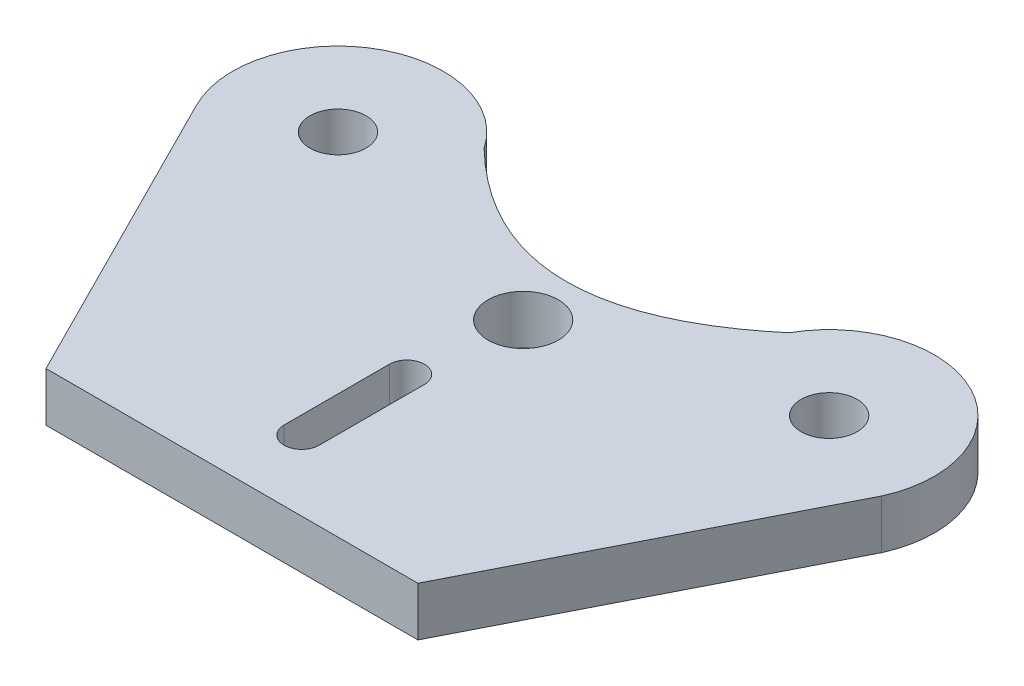
ISO-10303-21;
HEADER;
FILE_DESCRIPTION(('STEP AP214'),'2;1');
FILE_NAME('part.step','',(''),(''),'','','');
FILE_SCHEMA(('AUTOMOTIVE_DESIGN { 1 0 10303 214 1 1 1 1 }'));
ENDSEC;
DATA;
#1=APPLICATION_CONTEXT('core data for automotive mechanical design processes');
#2=APPLICATION_PROTOCOL_DEFINITION('international standard','automotive_design',2000,#1);
#3=PRODUCT_CONTEXT('',#1,'mechanical');
#4=PRODUCT('Part','Part','',(#3));
#5=PRODUCT_RELATED_PRODUCT_CATEGORY('part','',(#4));
#6=PRODUCT_DEFINITION_FORMATION('','',#4);
#7=PRODUCT_DEFINITION_CONTEXT('part definition',#1,'design');
#8=PRODUCT_DEFINITION('design','',#6,#7);
#9=PRODUCT_DEFINITION_SHAPE('','',#8);
#10=(LENGTH_UNIT() NAMED_UNIT(*) SI_UNIT(.MILLI.,.METRE.));
#11=(NAMED_UNIT(*) PLANE_ANGLE_UNIT() SI_UNIT($,.RADIAN.));
#12=(NAMED_UNIT(*) SI_UNIT($,.STERADIAN.) SOLID_ANGLE_UNIT());
#13=UNCERTAINTY_MEASURE_WITH_UNIT(LENGTH_MEASURE(1.E-05),#10,'distance_accuracy_value','');
#14=(GEOMETRIC_REPRESENTATION_CONTEXT(3) GLOBAL_UNCERTAINTY_ASSIGNED_CONTEXT((#13)) GLOBAL_UNIT_ASSIGNED_CONTEXT((#10,
#11,#12)) REPRESENTATION_CONTEXT('',''));
#15=CARTESIAN_POINT('',(0.,0.,0.));
#16=DIRECTION('',(0.,0.,1.));
#17=DIRECTION('',(1.,0.,0.));
#18=AXIS2_PLACEMENT_3D('',#15,#16,#17);
#19=CARTESIAN_POINT('',(15.7945619630282,8.89,-10.6505545581469));
#20=CARTESIAN_POINT('',(42.7377403086619,8.89,15.557403772143));
#21=CARTESIAN_POINT('',(72.3058060061121,8.89,-9.35602616997276));
#22=B_SPLINE_CURVE_WITH_KNOTS('',2,(#19,#20,#21),.UNSPECIFIED.,.F.,.F.,(3,3),(0.,1.),.UNSPECIFIED.);
#23=DIRECTION('',(0.,-1.,0.));
#24=VECTOR('',#23,1.);
#25=SURFACE_OF_LINEAR_EXTRUSION('',#22,#24);
#26=CARTESIAN_POINT('',(15.7945619630282,0.,-10.6505545581469));
#27=CARTESIAN_POINT('',(42.7377403086619,0.,15.557403772143));
#28=CARTESIAN_POINT('',(72.3058060061121,0.,-9.35602616997276));
#29=B_SPLINE_CURVE_WITH_KNOTS('',2,(#26,#27,#28),.UNSPECIFIED.,.F.,.F.,(3,3),(0.,1.),.UNSPECIFIED.);
#30=CARTESIAN_POINT('',(15.7945619630282,0.,-10.6505545581469));
#31=VERTEX_POINT('',#30);
#32=CARTESIAN_POINT('',(72.3058060061121,0.,-9.35602616997275));
#33=VERTEX_POINT('',#32);
#34=EDGE_CURVE('E139',#31,#33,#29,.T.);
#35=ORIENTED_EDGE('',*,*,#34,.F.);
#36=DIRECTION('',(0.,-1.,0.));
#37=VECTOR('',#36,1.);
#38=CARTESIAN_POINT('',(15.7945619630282,8.89,-10.6505545581469));
#39=LINE('',#38,#37);
#40=CARTESIAN_POINT('',(15.7945619630282,8.89,-10.6505545581469));
#41=VERTEX_POINT('',#40);
#42=EDGE_CURVE('E11',#41,#31,#39,.T.);
#43=ORIENTED_EDGE('',*,*,#42,.F.);
#44=CARTESIAN_POINT('',(72.3058060061121,8.89,-9.35602616997275));
#45=VERTEX_POINT('',#44);
#46=EDGE_CURVE('E141',#41,#45,#22,.T.);
#47=ORIENTED_EDGE('',*,*,#46,.T.);
#48=DIRECTION('',(0.,-1.,0.));
#49=VECTOR('',#48,1.);
#50=CARTESIAN_POINT('',(72.3058060061121,8.89,-9.35602616997275));
#51=LINE('',#50,#49);
#52=EDGE_CURVE('E162',#45,#33,#51,.T.);
#53=ORIENTED_EDGE('',*,*,#52,.T.);
#54=EDGE_LOOP('',(#35,#43,#47,#53));
#55=FACE_BOUND('',#54,.T.);
#56=ADVANCED_FACE('F34',(#55),#25,.T.);
#57=CARTESIAN_POINT('',(0.,8.89,0.));
#58=DIRECTION('',(0.,-1.,0.));
#59=DIRECTION('',(0.,0.,-1.));
#60=AXIS2_PLACEMENT_3D('',#57,#58,#59);
#61=CYLINDRICAL_SURFACE('',#60,19.05);
#62=CARTESIAN_POINT('',(0.,0.,0.));
#63=DIRECTION('',(0.,1.,0.));
#64=DIRECTION('',(0.,0.,1.));
#65=AXIS2_PLACEMENT_3D('',#62,#63,#64);
#66=CIRCLE('',#65,19.05);
#67=CARTESIAN_POINT('',(-17.0125978889924,0.,8.57169837706926));
#68=VERTEX_POINT('',#67);
#69=EDGE_CURVE('E167',#31,#68,#66,.T.);
#70=ORIENTED_EDGE('',*,*,#69,.T.);
#71=DIRECTION('',(0.,-1.,0.));
#72=VECTOR('',#71,1.);
#73=CARTESIAN_POINT('',(-17.0125978889924,8.89,8.57169837706926));
#74=LINE('',#73,#72);
#75=CARTESIAN_POINT('',(-17.0125978889924,8.89,8.57169837706926));
#76=VERTEX_POINT('',#75);
#77=EDGE_CURVE('E42',#76,#68,#74,.T.);
#78=ORIENTED_EDGE('',*,*,#77,.F.);
#79=CARTESIAN_POINT('',(0.,8.89,0.));
#80=DIRECTION('',(0.,1.,0.));
#81=DIRECTION('',(0.,0.,1.));
#82=AXIS2_PLACEMENT_3D('',#79,#80,#81);
#83=CIRCLE('',#82,19.05);
#84=EDGE_CURVE('E147',#41,#76,#83,.T.);
#85=ORIENTED_EDGE('',*,*,#84,.F.);
#86=ORIENTED_EDGE('',*,*,#42,.T.);
#87=EDGE_LOOP('',(#70,#78,#85,#86));
#88=FACE_BOUND('',#87,.T.);
#89=ADVANCED_FACE('F198',(#88),#61,.T.);
#90=CARTESIAN_POINT('',(-17.0125978889924,8.89,8.57169837706925));
#91=DIRECTION('',(-0.893049757952356,0.,0.449957920056129));
#92=DIRECTION('',(0.449957920056129,0.,0.893049757952357));
#93=AXIS2_PLACEMENT_3D('',#90,#91,#92);
#94=PLANE('',#93);
#95=DIRECTION('',(-0.449957920056129,0.,-0.893049757952357));
#96=VECTOR('',#95,1.);
#97=CARTESIAN_POINT('',(-17.0125978889924,0.,8.57169837706925));
#98=LINE('',#97,#96);
#99=CARTESIAN_POINT('',(10.6627070202646,0.,63.5));
#100=VERTEX_POINT('',#99);
#101=EDGE_CURVE('E173',#100,#68,#98,.T.);
#102=ORIENTED_EDGE('',*,*,#101,.F.);
#103=DIRECTION('',(0.,-1.,0.));
#104=VECTOR('',#103,1.);
#105=CARTESIAN_POINT('',(10.6627070202646,8.89,63.5));
#106=LINE('',#105,#104);
#107=CARTESIAN_POINT('',(10.6627070202646,8.89,63.5));
#108=VERTEX_POINT('',#107);
#109=EDGE_CURVE('E189',#108,#100,#106,.T.);
#110=ORIENTED_EDGE('',*,*,#109,.F.);
#111=DIRECTION('',(-0.449957920056129,0.,-0.893049757952357));
#112=VECTOR('',#111,1.);
#113=CARTESIAN_POINT('',(-17.0125978889924,8.89,8.57169837706925));
#114=LINE('',#113,#112);
#115=EDGE_CURVE('E153',#108,#76,#114,.T.);
#116=ORIENTED_EDGE('',*,*,#115,.T.);
#117=ORIENTED_EDGE('',*,*,#77,.T.);
#118=EDGE_LOOP('',(#102,#110,#116,#117));
#119=FACE_BOUND('',#118,.T.);
#120=ADVANCED_FACE('F193',(#119),#94,.T.);
#121=CARTESIAN_POINT('',(0.,8.89,63.5));
#122=DIRECTION('',(0.,0.,-1.));
#123=DIRECTION('',(-1.,0.,0.));
#124=AXIS2_PLACEMENT_3D('',#121,#122,#123);
#125=PLANE('',#124);
#126=DIRECTION('',(1.,0.,0.));
#127=VECTOR('',#126,1.);
#128=CARTESIAN_POINT('',(0.,0.,63.5));
#129=LINE('',#128,#127);
#130=CARTESIAN_POINT('',(77.9727070202646,0.,63.5));
#131=VERTEX_POINT('',#130);
#132=EDGE_CURVE('E176',#100,#131,#129,.T.);
#133=ORIENTED_EDGE('',*,*,#132,.T.);
#134=DIRECTION('',(0.,-1.,0.));
#135=VECTOR('',#134,1.);
#136=CARTESIAN_POINT('',(77.9727070202646,8.89,63.5));
#137=LINE('',#136,#135);
#138=CARTESIAN_POINT('',(77.9727070202646,8.89,63.5));
#139=VERTEX_POINT('',#138);
#140=EDGE_CURVE('E186',#139,#131,#137,.T.);
#141=ORIENTED_EDGE('',*,*,#140,.F.);
#142=DIRECTION('',(1.,0.,0.));
#143=VECTOR('',#142,1.);
#144=CARTESIAN_POINT('',(0.,8.89,63.5));
#145=LINE('',#144,#143);
#146=EDGE_CURVE('E156',#108,#139,#145,.T.);
#147=ORIENTED_EDGE('',*,*,#146,.F.);
#148=ORIENTED_EDGE('',*,*,#109,.T.);
#149=EDGE_LOOP('',(#133,#141,#147,#148));
#150=FACE_BOUND('',#149,.T.);
#151=ADVANCED_FACE('F207',(#150),#125,.F.);
#152=CARTESIAN_POINT('',(87.6139425259222,8.89,44.5310737627336));
#153=DIRECTION('',(-0.891460709875178,0.,-0.453098005677408));
#154=DIRECTION('',(-0.453098005677408,0.,0.891460709875178));
#155=AXIS2_PLACEMENT_3D('',#152,#153,#154);
#156=PLANE('',#155);
#157=DIRECTION('',(0.453098005677408,0.,-0.891460709875178));
#158=VECTOR('',#157,1.);
#159=CARTESIAN_POINT('',(87.6139425259222,0.,44.5310737627336));
#160=LINE('',#159,#158);
#161=CARTESIAN_POINT('',(106.255653046921,0.,7.85390395376012));
#162=VERTEX_POINT('',#161);
#163=EDGE_CURVE('E178',#131,#162,#160,.T.);
#164=ORIENTED_EDGE('',*,*,#163,.T.);
#165=DIRECTION('',(0.,-1.,0.));
#166=VECTOR('',#165,1.);
#167=CARTESIAN_POINT('',(106.255653046921,8.89,7.85390395376012));
#168=LINE('',#167,#166);
#169=CARTESIAN_POINT('',(106.255653046921,8.89,7.85390395376012));
#170=VERTEX_POINT('',#169);
#171=EDGE_CURVE('E183',#170,#162,#168,.T.);
#172=ORIENTED_EDGE('',*,*,#171,.F.);
#173=DIRECTION('',(0.453098005677408,0.,-0.891460709875178));
#174=VECTOR('',#173,1.);
#175=CARTESIAN_POINT('',(87.6139425259222,8.89,44.5310737627336));
#176=LINE('',#175,#174);
#177=EDGE_CURVE('E158',#139,#170,#176,.T.);
#178=ORIENTED_EDGE('',*,*,#177,.F.);
#179=ORIENTED_EDGE('',*,*,#140,.T.);
#180=EDGE_LOOP('',(#164,#172,#178,#179));
#181=FACE_BOUND('',#180,.T.);
#182=ADVANCED_FACE('F211',(#181),#156,.F.);
#183=CARTESIAN_POINT('',(88.9,8.89,0.));
#184=DIRECTION('',(0.,-1.,0.));
#185=DIRECTION('',(0.,0.,-1.));
#186=AXIS2_PLACEMENT_3D('',#183,#184,#185);
#187=CYLINDRICAL_SURFACE('',#186,19.05);
#188=CARTESIAN_POINT('',(88.9,0.,0.));
#189=DIRECTION('',(0.,1.,0.));
#190=DIRECTION('',(0.,0.,1.));
#191=AXIS2_PLACEMENT_3D('',#188,#189,#190);
#192=CIRCLE('',#191,19.05);
#193=EDGE_CURVE('E148',#162,#33,#192,.T.);
#194=ORIENTED_EDGE('',*,*,#193,.T.);
#195=ORIENTED_EDGE('',*,*,#52,.F.);
#196=CARTESIAN_POINT('',(88.9,8.89,0.));
#197=DIRECTION('',(0.,1.,0.));
#198=DIRECTION('',(0.,0.,1.));
#199=AXIS2_PLACEMENT_3D('',#196,#197,#198);
#200=CIRCLE('',#199,19.05);
#201=EDGE_CURVE('E160',#170,#45,#200,.T.);
#202=ORIENTED_EDGE('',*,*,#201,.F.);
#203=ORIENTED_EDGE('',*,*,#171,.T.);
#204=EDGE_LOOP('',(#194,#195,#202,#203));
#205=FACE_BOUND('',#204,.T.);
#206=ADVANCED_FACE('F218',(#205),#187,.T.);
#207=CARTESIAN_POINT('',(0.,8.89,0.));
#208=DIRECTION('',(0.,1.,0.));
#209=DIRECTION('',(0.,0.,1.));
#210=AXIS2_PLACEMENT_3D('',#207,#208,#209);
#211=PLANE('',#210);
#212=CARTESIAN_POINT('',(46.2307624542895,8.89,12.7));
#213=DIRECTION('',(0.,1.,0.));
#214=DIRECTION('',(0.,0.,1.));
#215=AXIS2_PLACEMENT_3D('',#212,#213,#214);
#216=CIRCLE('',#215,6.35);
#217=CARTESIAN_POINT('',(46.2307624542895,8.89,19.05));
#218=VERTEX_POINT('',#217);
#219=EDGE_CURVE('E336',#218,#218,#216,.T.);
#220=ORIENTED_EDGE('',*,*,#219,.F.);
#221=EDGE_LOOP('',(#220));
#222=FACE_BOUND('',#221,.T.);
#223=CARTESIAN_POINT('',(88.9,8.89,0.));
#224=DIRECTION('',(0.,1.,0.));
#225=DIRECTION('',(0.,0.,1.));
#226=AXIS2_PLACEMENT_3D('',#223,#224,#225);
#227=CIRCLE('',#226,5.08);
#228=CARTESIAN_POINT('',(88.9,8.89,5.08));
#229=VERTEX_POINT('',#228);
#230=EDGE_CURVE('E338',#229,#229,#227,.T.);
#231=ORIENTED_EDGE('',*,*,#230,.F.);
#232=EDGE_LOOP('',(#231));
#233=FACE_BOUND('',#232,.T.);
#234=CARTESIAN_POINT('',(0.,8.89,0.));
#235=DIRECTION('',(0.,1.,0.));
#236=DIRECTION('',(0.,0.,1.));
#237=AXIS2_PLACEMENT_3D('',#234,#235,#236);
#238=CIRCLE('',#237,5.08);
#239=CARTESIAN_POINT('',(0.,8.89,5.08));
#240=VERTEX_POINT('',#239);
#241=EDGE_CURVE('E346',#240,#240,#238,.T.);
#242=ORIENTED_EDGE('',*,*,#241,.F.);
#243=EDGE_LOOP('',(#242));
#244=FACE_BOUND('',#243,.T.);
#245=CARTESIAN_POINT('',(44.2311985586078,8.89,31.75));
#246=DIRECTION('',(0.,1.,0.));
#247=DIRECTION('',(0.,0.,1.));
#248=AXIS2_PLACEMENT_3D('',#245,#246,#247);
#249=CIRCLE('',#248,3.17499999999999);
#250=CARTESIAN_POINT('',(47.4061985586078,8.89,31.75));
#251=VERTEX_POINT('',#250);
#252=CARTESIAN_POINT('',(41.0561985586078,8.89,31.75));
#253=VERTEX_POINT('',#252);
#254=EDGE_CURVE('E49',#251,#253,#249,.T.);
#255=ORIENTED_EDGE('',*,*,#254,.F.);
#256=DIRECTION('',(0.,0.,-1.));
#257=VECTOR('',#256,1.);
#258=CARTESIAN_POINT('',(47.4061985586078,8.89,31.75));
#259=LINE('',#258,#257);
#260=CARTESIAN_POINT('',(47.4061985586078,8.89,50.8));
#261=VERTEX_POINT('',#260);
#262=EDGE_CURVE('E129',#261,#251,#259,.T.);
#263=ORIENTED_EDGE('',*,*,#262,.F.);
#264=CARTESIAN_POINT('',(44.2311985586078,8.89,50.8));
#265=DIRECTION('',(0.,1.,0.));
#266=DIRECTION('',(0.,0.,1.));
#267=AXIS2_PLACEMENT_3D('',#264,#265,#266);
#268=CIRCLE('',#267,3.175);
#269=CARTESIAN_POINT('',(41.0561985586078,8.89,50.8));
#270=VERTEX_POINT('',#269);
#271=EDGE_CURVE('E113',#270,#261,#268,.T.);
#272=ORIENTED_EDGE('',*,*,#271,.F.);
#273=DIRECTION('',(0.,0.,1.));
#274=VECTOR('',#273,1.);
#275=CARTESIAN_POINT('',(41.0561985586078,8.89,31.75));
#276=LINE('',#275,#274);
#277=EDGE_CURVE('E122',#253,#270,#276,.T.);
#278=ORIENTED_EDGE('',*,*,#277,.F.);
#279=EDGE_LOOP('',(#255,#263,#272,#278));
#280=FACE_BOUND('',#279,.T.);
#281=ORIENTED_EDGE('',*,*,#46,.F.);
#282=ORIENTED_EDGE('',*,*,#84,.T.);
#283=ORIENTED_EDGE('',*,*,#115,.F.);
#284=ORIENTED_EDGE('',*,*,#146,.T.);
#285=ORIENTED_EDGE('',*,*,#177,.T.);
#286=ORIENTED_EDGE('',*,*,#201,.T.);
#287=EDGE_LOOP('',(#281,#282,#283,#284,#285,#286));
#288=FACE_BOUND('',#287,.T.);
#289=ADVANCED_FACE('F126',(#222,#233,#244,#280,#288),#211,.T.);
#290=CARTESIAN_POINT('',(0.,0.,0.));
#291=DIRECTION('',(0.,1.,0.));
#292=DIRECTION('',(0.,0.,1.));
#293=AXIS2_PLACEMENT_3D('',#290,#291,#292);
#294=PLANE('',#293);
#295=CARTESIAN_POINT('',(46.2307624542895,0.,12.7));
#296=DIRECTION('',(0.,1.,0.));
#297=DIRECTION('',(0.,0.,1.));
#298=AXIS2_PLACEMENT_3D('',#295,#296,#297);
#299=CIRCLE('',#298,6.35);
#300=CARTESIAN_POINT('',(46.2307624542895,0.,19.05));
#301=VERTEX_POINT('',#300);
#302=EDGE_CURVE('E333',#301,#301,#299,.F.);
#303=ORIENTED_EDGE('',*,*,#302,.F.);
#304=EDGE_LOOP('',(#303));
#305=FACE_BOUND('',#304,.T.);
#306=CARTESIAN_POINT('',(88.9,0.,0.));
#307=DIRECTION('',(0.,1.,0.));
#308=DIRECTION('',(0.,0.,1.));
#309=AXIS2_PLACEMENT_3D('',#306,#307,#308);
#310=CIRCLE('',#309,5.08);
#311=CARTESIAN_POINT('',(88.9,0.,5.08));
#312=VERTEX_POINT('',#311);
#313=EDGE_CURVE('E343',#312,#312,#310,.F.);
#314=ORIENTED_EDGE('',*,*,#313,.F.);
#315=EDGE_LOOP('',(#314));
#316=FACE_BOUND('',#315,.T.);
#317=CARTESIAN_POINT('',(0.,0.,0.));
#318=DIRECTION('',(0.,1.,0.));
#319=DIRECTION('',(0.,0.,1.));
#320=AXIS2_PLACEMENT_3D('',#317,#318,#319);
#321=CIRCLE('',#320,5.08);
#322=CARTESIAN_POINT('',(0.,0.,5.08));
#323=VERTEX_POINT('',#322);
#324=EDGE_CURVE('E349',#323,#323,#321,.F.);
#325=ORIENTED_EDGE('',*,*,#324,.F.);
#326=EDGE_LOOP('',(#325));
#327=FACE_BOUND('',#326,.T.);
#328=DIRECTION('',(0.,0.,1.));
#329=VECTOR('',#328,1.);
#330=CARTESIAN_POINT('',(47.4061985586078,0.,31.75));
#331=LINE('',#330,#329);
#332=CARTESIAN_POINT('',(47.4061985586078,0.,31.75));
#333=VERTEX_POINT('',#332);
#334=CARTESIAN_POINT('',(47.4061985586078,0.,50.8));
#335=VERTEX_POINT('',#334);
#336=EDGE_CURVE('E353',#333,#335,#331,.T.);
#337=ORIENTED_EDGE('',*,*,#336,.F.);
#338=CARTESIAN_POINT('',(44.2311985586078,0.,31.75));
#339=DIRECTION('',(0.,1.,0.));
#340=DIRECTION('',(0.,0.,1.));
#341=AXIS2_PLACEMENT_3D('',#338,#339,#340);
#342=CIRCLE('',#341,3.17499999999999);
#343=CARTESIAN_POINT('',(41.0561985586078,0.,31.75));
#344=VERTEX_POINT('',#343);
#345=EDGE_CURVE('E140',#344,#333,#342,.F.);
#346=ORIENTED_EDGE('',*,*,#345,.F.);
#347=DIRECTION('',(0.,0.,-1.));
#348=VECTOR('',#347,1.);
#349=CARTESIAN_POINT('',(41.0561985586078,0.,31.75));
#350=LINE('',#349,#348);
#351=CARTESIAN_POINT('',(41.0561985586078,0.,50.8));
#352=VERTEX_POINT('',#351);
#353=EDGE_CURVE('E138',#352,#344,#350,.T.);
#354=ORIENTED_EDGE('',*,*,#353,.F.);
#355=CARTESIAN_POINT('',(44.2311985586078,0.,50.8));
#356=DIRECTION('',(0.,1.,0.));
#357=DIRECTION('',(0.,0.,1.));
#358=AXIS2_PLACEMENT_3D('',#355,#356,#357);
#359=CIRCLE('',#358,3.175);
#360=EDGE_CURVE('E116',#335,#352,#359,.F.);
#361=ORIENTED_EDGE('',*,*,#360,.F.);
#362=EDGE_LOOP('',(#337,#346,#354,#361));
#363=FACE_BOUND('',#362,.T.);
#364=ORIENTED_EDGE('',*,*,#34,.T.);
#365=ORIENTED_EDGE('',*,*,#193,.F.);
#366=ORIENTED_EDGE('',*,*,#163,.F.);
#367=ORIENTED_EDGE('',*,*,#132,.F.);
#368=ORIENTED_EDGE('',*,*,#101,.T.);
#369=ORIENTED_EDGE('',*,*,#69,.F.);
#370=EDGE_LOOP('',(#364,#365,#366,#367,#368,#369));
#371=FACE_BOUND('',#370,.T.);
#372=ADVANCED_FACE('F202',(#305,#316,#327,#363,#371),#294,.F.);
#373=CARTESIAN_POINT('',(44.2311985586078,-26.1817207226721,31.75));
#374=DIRECTION('',(0.,1.,0.));
#375=DIRECTION('',(0.,0.,1.));
#376=AXIS2_PLACEMENT_3D('',#373,#374,#375);
#377=CYLINDRICAL_SURFACE('',#376,3.17499999999999);
#378=ORIENTED_EDGE('',*,*,#345,.T.);
#379=DIRECTION('',(0.,1.,0.));
#380=VECTOR('',#379,1.);
#381=CARTESIAN_POINT('',(47.4061985586078,-26.1817207226721,31.75));
#382=LINE('',#381,#380);
#383=EDGE_CURVE('E134',#333,#251,#382,.T.);
#384=ORIENTED_EDGE('',*,*,#383,.T.);
#385=ORIENTED_EDGE('',*,*,#254,.T.);
#386=DIRECTION('',(0.,1.,0.));
#387=VECTOR('',#386,1.);
#388=CARTESIAN_POINT('',(41.0561985586078,-26.1817207226721,31.75));
#389=LINE('',#388,#387);
#390=EDGE_CURVE('E119',#344,#253,#389,.T.);
#391=ORIENTED_EDGE('',*,*,#390,.F.);
#392=EDGE_LOOP('',(#378,#384,#385,#391));
#393=FACE_BOUND('',#392,.T.);
#394=ADVANCED_FACE('F258',(#393),#377,.F.);
#395=CARTESIAN_POINT('',(47.4061985586078,-26.1817207226721,31.75));
#396=DIRECTION('',(1.,0.,0.));
#397=DIRECTION('',(0.,0.,-1.));
#398=AXIS2_PLACEMENT_3D('',#395,#396,#397);
#399=PLANE('',#398);
#400=ORIENTED_EDGE('',*,*,#336,.T.);
#401=DIRECTION('',(0.,1.,0.));
#402=VECTOR('',#401,1.);
#403=CARTESIAN_POINT('',(47.4061985586078,-26.1817207226721,50.8));
#404=LINE('',#403,#402);
#405=EDGE_CURVE('E118',#335,#261,#404,.T.);
#406=ORIENTED_EDGE('',*,*,#405,.T.);
#407=ORIENTED_EDGE('',*,*,#262,.T.);
#408=ORIENTED_EDGE('',*,*,#383,.F.);
#409=EDGE_LOOP('',(#400,#406,#407,#408));
#410=FACE_BOUND('',#409,.T.);
#411=ADVANCED_FACE('F263',(#410),#399,.F.);
#412=CARTESIAN_POINT('',(44.2311985586078,-26.1817207226721,50.8));
#413=DIRECTION('',(0.,1.,0.));
#414=DIRECTION('',(0.,0.,1.));
#415=AXIS2_PLACEMENT_3D('',#412,#413,#414);
#416=CYLINDRICAL_SURFACE('',#415,3.175);
#417=ORIENTED_EDGE('',*,*,#360,.T.);
#418=DIRECTION('',(0.,1.,0.));
#419=VECTOR('',#418,1.);
#420=CARTESIAN_POINT('',(41.0561985586078,-26.1817207226721,50.8));
#421=LINE('',#420,#419);
#422=EDGE_CURVE('E57',#352,#270,#421,.T.);
#423=ORIENTED_EDGE('',*,*,#422,.T.);
#424=ORIENTED_EDGE('',*,*,#271,.T.);
#425=ORIENTED_EDGE('',*,*,#405,.F.);
#426=EDGE_LOOP('',(#417,#423,#424,#425));
#427=FACE_BOUND('',#426,.T.);
#428=ADVANCED_FACE('F110',(#427),#416,.F.);
#429=CARTESIAN_POINT('',(41.0561985586078,-26.1817207226721,31.75));
#430=DIRECTION('',(-1.,0.,0.));
#431=DIRECTION('',(0.,0.,1.));
#432=AXIS2_PLACEMENT_3D('',#429,#430,#431);
#433=PLANE('',#432);
#434=ORIENTED_EDGE('',*,*,#353,.T.);
#435=ORIENTED_EDGE('',*,*,#390,.T.);
#436=ORIENTED_EDGE('',*,*,#277,.T.);
#437=ORIENTED_EDGE('',*,*,#422,.F.);
#438=EDGE_LOOP('',(#434,#435,#436,#437));
#439=FACE_BOUND('',#438,.T.);
#440=ADVANCED_FACE('F123',(#439),#433,.F.);
#441=CARTESIAN_POINT('',(0.,-14.3684097937106,0.));
#442=DIRECTION('',(0.,1.,0.));
#443=DIRECTION('',(0.,0.,1.));
#444=AXIS2_PLACEMENT_3D('',#441,#442,#443);
#445=CYLINDRICAL_SURFACE('',#444,5.08);
#446=ORIENTED_EDGE('',*,*,#324,.T.);
#447=EDGE_LOOP('',(#446));
#448=FACE_BOUND('',#447,.T.);
#449=ORIENTED_EDGE('',*,*,#241,.T.);
#450=EDGE_LOOP('',(#449));
#451=FACE_BOUND('',#450,.T.);
#452=ADVANCED_FACE('F291',(#448,#451),#445,.F.);
#453=CARTESIAN_POINT('',(88.9,-14.3684097937107,0.));
#454=DIRECTION('',(0.,1.,0.));
#455=DIRECTION('',(0.,0.,1.));
#456=AXIS2_PLACEMENT_3D('',#453,#454,#455);
#457=CYLINDRICAL_SURFACE('',#456,5.08);
#458=CARTESIAN_POINT('',(88.9,0.,5.08));
#459=CARTESIAN_POINT('',(88.9,0.0926041666666651,5.08));
#460=CARTESIAN_POINT('',(88.9,0.185208333333332,5.08));
#461=CARTESIAN_POINT('',(88.9,0.370416666666665,5.08));
#462=CARTESIAN_POINT('',(88.9,0.463020833333332,5.08));
#463=CARTESIAN_POINT('',(88.9,0.648229166666665,5.08));
#464=CARTESIAN_POINT('',(88.9,0.740833333333331,5.08));
#465=CARTESIAN_POINT('',(88.9,0.926041666666664,5.08));
#466=CARTESIAN_POINT('',(88.9,1.01864583333333,5.08));
#467=CARTESIAN_POINT('',(88.9,1.20385416666666,5.08));
#468=CARTESIAN_POINT('',(88.9,1.29645833333333,5.08));
#469=CARTESIAN_POINT('',(88.9,1.48166666666666,5.08));
#470=CARTESIAN_POINT('',(88.9,1.57427083333333,5.08));
#471=CARTESIAN_POINT('',(88.9,1.75947916666666,5.08));
#472=CARTESIAN_POINT('',(88.9,1.85208333333333,5.08));
#473=CARTESIAN_POINT('',(88.9,2.03729166666666,5.08));
#474=CARTESIAN_POINT('',(88.9,2.12989583333333,5.08));
#475=CARTESIAN_POINT('',(88.9,2.31510416666666,5.08));
#476=CARTESIAN_POINT('',(88.9,2.40770833333333,5.08));
#477=CARTESIAN_POINT('',(88.9,2.59291666666666,5.08));
#478=CARTESIAN_POINT('',(88.9,2.68552083333333,5.08));
#479=CARTESIAN_POINT('',(88.9,2.87072916666666,5.08));
#480=CARTESIAN_POINT('',(88.9,2.96333333333333,5.08));
#481=CARTESIAN_POINT('',(88.9,3.14854166666666,5.08));
#482=CARTESIAN_POINT('',(88.9,3.24114583333333,5.08));
#483=CARTESIAN_POINT('',(88.9,3.42635416666666,5.08));
#484=CARTESIAN_POINT('',(88.9,3.51895833333333,5.08));
#485=CARTESIAN_POINT('',(88.9,3.70416666666666,5.08));
#486=CARTESIAN_POINT('',(88.9,3.79677083333333,5.08));
#487=CARTESIAN_POINT('',(88.9,3.98197916666666,5.08));
#488=CARTESIAN_POINT('',(88.9,4.07458333333333,5.08));
#489=CARTESIAN_POINT('',(88.9,4.25979166666666,5.08));
#490=CARTESIAN_POINT('',(88.9,4.35239583333333,5.08));
#491=CARTESIAN_POINT('',(88.9,4.53760416666666,5.08));
#492=CARTESIAN_POINT('',(88.9,4.63020833333333,5.08));
#493=CARTESIAN_POINT('',(88.9,4.81541666666666,5.08));
#494=CARTESIAN_POINT('',(88.9,4.90802083333333,5.08));
#495=CARTESIAN_POINT('',(88.9,5.09322916666666,5.08));
#496=CARTESIAN_POINT('',(88.9,5.18583333333333,5.08));
#497=CARTESIAN_POINT('',(88.9,5.37104166666666,5.08));
#498=CARTESIAN_POINT('',(88.9,5.46364583333333,5.08));
#499=CARTESIAN_POINT('',(88.9,5.64885416666666,5.08));
#500=CARTESIAN_POINT('',(88.9,5.74145833333333,5.08));
#501=CARTESIAN_POINT('',(88.9,5.92666666666666,5.08));
#502=CARTESIAN_POINT('',(88.9,6.01927083333333,5.08));
#503=CARTESIAN_POINT('',(88.9,6.20447916666666,5.08));
#504=CARTESIAN_POINT('',(88.9,6.29708333333333,5.08));
#505=CARTESIAN_POINT('',(88.9,6.48229166666666,5.08));
#506=CARTESIAN_POINT('',(88.9,6.57489583333333,5.08));
#507=CARTESIAN_POINT('',(88.9,6.76010416666666,5.08));
#508=CARTESIAN_POINT('',(88.9,6.85270833333333,5.08));
#509=CARTESIAN_POINT('',(88.9,7.03791666666666,5.08));
#510=CARTESIAN_POINT('',(88.9,7.13052083333333,5.08));
#511=CARTESIAN_POINT('',(88.9,7.31572916666666,5.08));
#512=CARTESIAN_POINT('',(88.9,7.40833333333333,5.08));
#513=CARTESIAN_POINT('',(88.9,7.59354166666666,5.08));
#514=CARTESIAN_POINT('',(88.9,7.68614583333333,5.08));
#515=CARTESIAN_POINT('',(88.9,7.87135416666666,5.08));
#516=CARTESIAN_POINT('',(88.9,7.96395833333333,5.08));
#517=CARTESIAN_POINT('',(88.9,8.14916666666666,5.08));
#518=CARTESIAN_POINT('',(88.9,8.24177083333333,5.08));
#519=CARTESIAN_POINT('',(88.9,8.42697916666666,5.08));
#520=CARTESIAN_POINT('',(88.9,8.51958333333333,5.08));
#521=CARTESIAN_POINT('',(88.9,8.70479166666666,5.08));
#522=CARTESIAN_POINT('',(88.9,8.79739583333333,5.08));
#523=CARTESIAN_POINT('',(88.9,8.89,5.08));
#524=B_SPLINE_CURVE_WITH_KNOTS('',3,(#458,#459,#460,#461,#462,#463,#464,#465,#466,#467,#468,
#469,#470,#471,#472,#473,#474,#475,#476,#477,#478,#479,#480,#481,#482,#483,#484,#485,#486,#487,
#488,#489,#490,#491,#492,#493,#494,#495,#496,#497,#498,#499,#500,#501,#502,#503,#504,#505,#506,
#507,#508,#509,#510,#511,#512,#513,#514,#515,#516,#517,#518,#519,#520,#521,#522,#523),
.UNSPECIFIED.,.F.,.F.,(4,2,2,2,2,2,2,2,2,2,2,2,2,2,2,2,2,2,2,2,2,2,2,2,2,2,2,2,2,2,2,2,4),(0.,
0.2778125,0.555625000000001,0.833437499999999,1.11125,1.3890625,1.666875,1.9446875,2.2225,
2.5003125,2.778125,3.0559375,3.33375,3.6115625,3.889375,4.1671875,4.445,4.7228125,5.000625,
5.2784375,5.55625,5.8340625,6.111875,6.3896875,6.6675,6.9453125,7.223125,7.5009375,7.77875,
8.0565625,8.334375,8.6121875,8.89),.UNSPECIFIED.);
#525=EDGE_CURVE('BSEAM300',#312,#229,#524,.T.);
#526=ORIENTED_EDGE('',*,*,#313,.T.);
#527=ORIENTED_EDGE('',*,*,#230,.T.);
#528=ORIENTED_EDGE('',*,*,#525,.T.);
#529=ORIENTED_EDGE('',*,*,#525,.F.);
#530=EDGE_LOOP('',(#526,#528,#527,#529));
#531=FACE_BOUND('',#530,.T.);
#532=ADVANCED_FACE('F300',(#531),#457,.F.);
#533=CARTESIAN_POINT('',(46.2307624542895,-17.9605122421383,12.7));
#534=DIRECTION('',(0.,1.,0.));
#535=DIRECTION('',(0.,0.,1.));
#536=AXIS2_PLACEMENT_3D('',#533,#534,#535);
#537=CYLINDRICAL_SURFACE('',#536,6.35);
#538=ORIENTED_EDGE('',*,*,#302,.T.);
#539=EDGE_LOOP('',(#538));
#540=FACE_BOUND('',#539,.T.);
#541=ORIENTED_EDGE('',*,*,#219,.T.);
#542=EDGE_LOOP('',(#541));
#543=FACE_BOUND('',#542,.T.);
#544=ADVANCED_FACE('F309',(#540,#543),#537,.F.);
#545=CLOSED_SHELL('',(#56,#89,#120,#151,#182,#206,#289,#372,#394,#411,#428,#440,#452,#532,#544));
#546=MANIFOLD_SOLID_BREP('B2',#545);
#547=ADVANCED_BREP_SHAPE_REPRESENTATION('',(#18,#546),#14);
#548=SHAPE_DEFINITION_REPRESENTATION(#9,#547);
ENDSEC;
END-ISO-10303-21;
